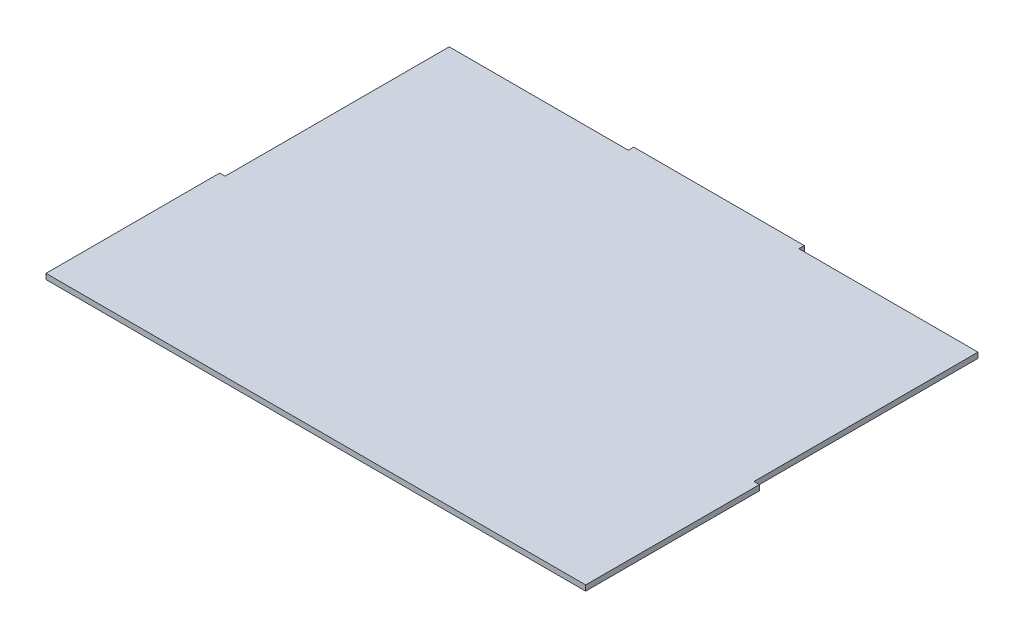
ISO-10303-21;
HEADER;
FILE_DESCRIPTION(('STEP AP214'),'2;1');
FILE_NAME('part.step','',(''),(''),'','','');
FILE_SCHEMA(('AUTOMOTIVE_DESIGN { 1 0 10303 214 1 1 1 1 }'));
ENDSEC;
DATA;
#1=APPLICATION_CONTEXT('core data for automotive mechanical design processes');
#2=APPLICATION_PROTOCOL_DEFINITION('international standard','automotive_design',2000,#1);
#3=PRODUCT_CONTEXT('',#1,'mechanical');
#4=PRODUCT('Part','Part','',(#3));
#5=PRODUCT_RELATED_PRODUCT_CATEGORY('part','',(#4));
#6=PRODUCT_DEFINITION_FORMATION('','',#4);
#7=PRODUCT_DEFINITION_CONTEXT('part definition',#1,'design');
#8=PRODUCT_DEFINITION('design','',#6,#7);
#9=PRODUCT_DEFINITION_SHAPE('','',#8);
#10=(LENGTH_UNIT() NAMED_UNIT(*) SI_UNIT(.MILLI.,.METRE.));
#11=(NAMED_UNIT(*) PLANE_ANGLE_UNIT() SI_UNIT($,.RADIAN.));
#12=(NAMED_UNIT(*) SI_UNIT($,.STERADIAN.) SOLID_ANGLE_UNIT());
#13=UNCERTAINTY_MEASURE_WITH_UNIT(LENGTH_MEASURE(1.E-05),#10,'distance_accuracy_value','');
#14=(GEOMETRIC_REPRESENTATION_CONTEXT(3) GLOBAL_UNCERTAINTY_ASSIGNED_CONTEXT((#13)) GLOBAL_UNIT_ASSIGNED_CONTEXT((#10,
#11,#12)) REPRESENTATION_CONTEXT('',''));
#15=CARTESIAN_POINT('',(0.,0.,0.));
#16=DIRECTION('',(0.,0.,1.));
#17=DIRECTION('',(1.,0.,0.));
#18=AXIS2_PLACEMENT_3D('',#15,#16,#17);
#19=CARTESIAN_POINT('',(0.,0.,0.));
#20=DIRECTION('',(0.,0.,-1.));
#21=DIRECTION('',(-1.,0.,0.));
#22=AXIS2_PLACEMENT_3D('',#19,#20,#21);
#23=PLANE('',#22);
#24=DIRECTION('',(0.,-1.,0.));
#25=VECTOR('',#24,1.);
#26=CARTESIAN_POINT('',(49.84,1.5875,0.));
#27=LINE('',#26,#25);
#28=CARTESIAN_POINT('',(49.84,1.5875,0.));
#29=VERTEX_POINT('',#28);
#30=CARTESIAN_POINT('',(49.84,-1.5875,0.));
#31=VERTEX_POINT('',#30);
#32=EDGE_CURVE('E157',#29,#31,#27,.T.);
#33=ORIENTED_EDGE('',*,*,#32,.F.);
#34=DIRECTION('',(-1.,0.,0.));
#35=VECTOR('',#34,1.);
#36=CARTESIAN_POINT('',(-157.79,1.5875,0.));
#37=LINE('',#36,#35);
#38=CARTESIAN_POINT('',(154.615,1.5875,0.));
#39=VERTEX_POINT('',#38);
#40=EDGE_CURVE('E212',#39,#29,#37,.T.);
#41=ORIENTED_EDGE('',*,*,#40,.F.);
#42=DIRECTION('',(0.,1.,0.));
#43=VECTOR('',#42,1.);
#44=CARTESIAN_POINT('',(154.615,-1.5875,0.));
#45=LINE('',#44,#43);
#46=CARTESIAN_POINT('',(154.615,-1.5875,0.));
#47=VERTEX_POINT('',#46);
#48=EDGE_CURVE('E168',#47,#39,#45,.T.);
#49=ORIENTED_EDGE('',*,*,#48,.F.);
#50=DIRECTION('',(1.,0.,0.));
#51=VECTOR('',#50,1.);
#52=CARTESIAN_POINT('',(-157.79,-1.5875,0.));
#53=LINE('',#52,#51);
#54=EDGE_CURVE('E60',#31,#47,#53,.T.);
#55=ORIENTED_EDGE('',*,*,#54,.F.);
#56=EDGE_LOOP('',(#33,#41,#49,#55));
#57=FACE_BOUND('',#56,.T.);
#58=ADVANCED_FACE('F45',(#57),#23,.T.);
#59=CARTESIAN_POINT('',(157.79,-1.5875,232.600000128));
#60=DIRECTION('',(-1.,0.,0.));
#61=DIRECTION('',(0.,0.,1.));
#62=AXIS2_PLACEMENT_3D('',#59,#60,#61);
#63=PLANE('',#62);
#64=DIRECTION('',(0.,1.,0.));
#65=VECTOR('',#64,1.);
#66=CARTESIAN_POINT('',(157.79,-1.5875,130.999992));
#67=LINE('',#66,#65);
#68=CARTESIAN_POINT('',(157.79,-1.5875,130.999992));
#69=VERTEX_POINT('',#68);
#70=CARTESIAN_POINT('',(157.79,1.5875,130.999992));
#71=VERTEX_POINT('',#70);
#72=EDGE_CURVE('E169',#69,#71,#67,.T.);
#73=ORIENTED_EDGE('',*,*,#72,.T.);
#74=DIRECTION('',(0.,0.,-1.));
#75=VECTOR('',#74,1.);
#76=CARTESIAN_POINT('',(157.79,1.5875,232.600000128));
#77=LINE('',#76,#75);
#78=CARTESIAN_POINT('',(157.79,1.5875,232.600000128));
#79=VERTEX_POINT('',#78);
#80=EDGE_CURVE('E11',#79,#71,#77,.T.);
#81=ORIENTED_EDGE('',*,*,#80,.F.);
#82=DIRECTION('',(0.,1.,0.));
#83=VECTOR('',#82,1.);
#84=CARTESIAN_POINT('',(157.79,-1.5875,232.600000128));
#85=LINE('',#84,#83);
#86=CARTESIAN_POINT('',(157.79,-1.5875,232.600000128));
#87=VERTEX_POINT('',#86);
#88=EDGE_CURVE('E201',#87,#79,#85,.T.);
#89=ORIENTED_EDGE('',*,*,#88,.F.);
#90=DIRECTION('',(0.,0.,-1.));
#91=VECTOR('',#90,1.);
#92=CARTESIAN_POINT('',(157.79,-1.5875,232.600000128));
#93=LINE('',#92,#91);
#94=EDGE_CURVE('E211',#87,#69,#93,.T.);
#95=ORIENTED_EDGE('',*,*,#94,.T.);
#96=EDGE_LOOP('',(#73,#81,#89,#95));
#97=FACE_BOUND('',#96,.T.);
#98=ADVANCED_FACE('F47',(#97),#63,.F.);
#99=CARTESIAN_POINT('',(-157.79,1.5875,232.600000128));
#100=DIRECTION('',(0.,-1.,0.));
#101=DIRECTION('',(0.,0.,-1.));
#102=AXIS2_PLACEMENT_3D('',#99,#100,#101);
#103=PLANE('',#102);
#104=DIRECTION('',(1.,0.,0.));
#105=VECTOR('',#104,1.);
#106=CARTESIAN_POINT('',(-157.79,1.5875,130.999992));
#107=LINE('',#106,#105);
#108=CARTESIAN_POINT('',(154.615,1.5875,130.999992));
#109=VERTEX_POINT('',#108);
#110=EDGE_CURVE('E178',#109,#71,#107,.T.);
#111=ORIENTED_EDGE('',*,*,#110,.F.);
#112=DIRECTION('',(0.,0.,1.));
#113=VECTOR('',#112,1.);
#114=CARTESIAN_POINT('',(154.615,1.5875,232.600000128));
#115=LINE('',#114,#113);
#116=EDGE_CURVE('E172',#39,#109,#115,.T.);
#117=ORIENTED_EDGE('',*,*,#116,.F.);
#118=ORIENTED_EDGE('',*,*,#40,.T.);
#119=DIRECTION('',(0.,0.,1.));
#120=VECTOR('',#119,1.);
#121=CARTESIAN_POINT('',(49.84,1.5875,-3.175));
#122=LINE('',#121,#120);
#123=CARTESIAN_POINT('',(49.84,1.5875,-3.175));
#124=VERTEX_POINT('',#123);
#125=EDGE_CURVE('E251',#124,#29,#122,.T.);
#126=ORIENTED_EDGE('',*,*,#125,.F.);
#127=DIRECTION('',(1.,0.,0.));
#128=VECTOR('',#127,1.);
#129=CARTESIAN_POINT('',(49.84,1.5875,-3.175));
#130=LINE('',#129,#128);
#131=CARTESIAN_POINT('',(-49.84,1.5875,-3.175));
#132=VERTEX_POINT('',#131);
#133=EDGE_CURVE('E151',#132,#124,#130,.T.);
#134=ORIENTED_EDGE('',*,*,#133,.F.);
#135=DIRECTION('',(0.,0.,1.));
#136=VECTOR('',#135,1.);
#137=CARTESIAN_POINT('',(-49.84,1.5875,-3.175));
#138=LINE('',#137,#136);
#139=CARTESIAN_POINT('',(-49.84,1.5875,0.));
#140=VERTEX_POINT('',#139);
#141=EDGE_CURVE('E163',#132,#140,#138,.T.);
#142=ORIENTED_EDGE('',*,*,#141,.T.);
#143=CARTESIAN_POINT('',(-154.615,1.5875,0.));
#144=VERTEX_POINT('',#143);
#145=EDGE_CURVE('E200',#140,#144,#37,.T.);
#146=ORIENTED_EDGE('',*,*,#145,.T.);
#147=DIRECTION('',(0.,0.,1.));
#148=VECTOR('',#147,1.);
#149=CARTESIAN_POINT('',(-154.615,1.5875,232.600000128));
#150=LINE('',#149,#148);
#151=CARTESIAN_POINT('',(-154.615,1.5875,130.999992));
#152=VERTEX_POINT('',#151);
#153=EDGE_CURVE('E190',#144,#152,#150,.T.);
#154=ORIENTED_EDGE('',*,*,#153,.T.);
#155=DIRECTION('',(-1.,0.,0.));
#156=VECTOR('',#155,1.);
#157=CARTESIAN_POINT('',(-157.79,1.5875,130.999992));
#158=LINE('',#157,#156);
#159=CARTESIAN_POINT('',(-157.79,1.5875,130.999992));
#160=VERTEX_POINT('',#159);
#161=EDGE_CURVE('E197',#152,#160,#158,.T.);
#162=ORIENTED_EDGE('',*,*,#161,.T.);
#163=DIRECTION('',(0.,0.,-1.));
#164=VECTOR('',#163,1.);
#165=CARTESIAN_POINT('',(-157.79,1.5875,232.600000128));
#166=LINE('',#165,#164);
#167=CARTESIAN_POINT('',(-157.79,1.5875,232.600000128));
#168=VERTEX_POINT('',#167);
#169=EDGE_CURVE('E53',#168,#160,#166,.T.);
#170=ORIENTED_EDGE('',*,*,#169,.F.);
#171=DIRECTION('',(-1.,0.,0.));
#172=VECTOR('',#171,1.);
#173=CARTESIAN_POINT('',(-157.79,1.5875,232.600000128));
#174=LINE('',#173,#172);
#175=EDGE_CURVE('E204',#79,#168,#174,.T.);
#176=ORIENTED_EDGE('',*,*,#175,.F.);
#177=ORIENTED_EDGE('',*,*,#80,.T.);
#178=EDGE_LOOP('',(#111,#117,#118,#126,#134,#142,#146,#154,#162,#170,#176,#177));
#179=FACE_BOUND('',#178,.T.);
#180=ADVANCED_FACE('F229',(#179),#103,.F.);
#181=CARTESIAN_POINT('',(-157.79,-1.5875,232.600000128));
#182=DIRECTION('',(0.,1.,0.));
#183=DIRECTION('',(0.,0.,1.));
#184=AXIS2_PLACEMENT_3D('',#181,#182,#183);
#185=PLANE('',#184);
#186=DIRECTION('',(-1.,0.,0.));
#187=VECTOR('',#186,1.);
#188=CARTESIAN_POINT('',(157.79,-1.5875,130.999992));
#189=LINE('',#188,#187);
#190=CARTESIAN_POINT('',(154.615,-1.5875,130.999992));
#191=VERTEX_POINT('',#190);
#192=EDGE_CURVE('E161',#69,#191,#189,.T.);
#193=ORIENTED_EDGE('',*,*,#192,.F.);
#194=ORIENTED_EDGE('',*,*,#94,.F.);
#195=DIRECTION('',(1.,0.,0.));
#196=VECTOR('',#195,1.);
#197=CARTESIAN_POINT('',(-157.79,-1.5875,232.600000128));
#198=LINE('',#197,#196);
#199=CARTESIAN_POINT('',(-157.79,-1.5875,232.600000128));
#200=VERTEX_POINT('',#199);
#201=EDGE_CURVE('E209',#200,#87,#198,.T.);
#202=ORIENTED_EDGE('',*,*,#201,.F.);
#203=DIRECTION('',(0.,0.,-1.));
#204=VECTOR('',#203,1.);
#205=CARTESIAN_POINT('',(-157.79,-1.5875,232.600000128));
#206=LINE('',#205,#204);
#207=CARTESIAN_POINT('',(-157.79,-1.5875,130.999992));
#208=VERTEX_POINT('',#207);
#209=EDGE_CURVE('E218',#200,#208,#206,.T.);
#210=ORIENTED_EDGE('',*,*,#209,.T.);
#211=DIRECTION('',(1.,0.,0.));
#212=VECTOR('',#211,1.);
#213=CARTESIAN_POINT('',(-157.79,-1.5875,130.999992));
#214=LINE('',#213,#212);
#215=CARTESIAN_POINT('',(-154.615,-1.5875,130.999992));
#216=VERTEX_POINT('',#215);
#217=EDGE_CURVE('E180',#208,#216,#214,.T.);
#218=ORIENTED_EDGE('',*,*,#217,.T.);
#219=DIRECTION('',(0.,0.,-1.));
#220=VECTOR('',#219,1.);
#221=CARTESIAN_POINT('',(-154.615,-1.5875,0.));
#222=LINE('',#221,#220);
#223=CARTESIAN_POINT('',(-154.615,-1.5875,0.));
#224=VERTEX_POINT('',#223);
#225=EDGE_CURVE('E183',#216,#224,#222,.T.);
#226=ORIENTED_EDGE('',*,*,#225,.T.);
#227=CARTESIAN_POINT('',(-49.84,-1.5875,0.));
#228=VERTEX_POINT('',#227);
#229=EDGE_CURVE('E205',#224,#228,#53,.T.);
#230=ORIENTED_EDGE('',*,*,#229,.T.);
#231=DIRECTION('',(0.,0.,1.));
#232=VECTOR('',#231,1.);
#233=CARTESIAN_POINT('',(-49.84,-1.5875,-3.175));
#234=LINE('',#233,#232);
#235=CARTESIAN_POINT('',(-49.84,-1.5875,-3.175));
#236=VERTEX_POINT('',#235);
#237=EDGE_CURVE('E142',#236,#228,#234,.T.);
#238=ORIENTED_EDGE('',*,*,#237,.F.);
#239=DIRECTION('',(-1.,0.,0.));
#240=VECTOR('',#239,1.);
#241=CARTESIAN_POINT('',(49.84,-1.5875,-3.175));
#242=LINE('',#241,#240);
#243=CARTESIAN_POINT('',(49.84,-1.5875,-3.175));
#244=VERTEX_POINT('',#243);
#245=EDGE_CURVE('E134',#244,#236,#242,.T.);
#246=ORIENTED_EDGE('',*,*,#245,.F.);
#247=DIRECTION('',(0.,0.,1.));
#248=VECTOR('',#247,1.);
#249=CARTESIAN_POINT('',(49.84,-1.5875,-3.175));
#250=LINE('',#249,#248);
#251=EDGE_CURVE('E139',#244,#31,#250,.T.);
#252=ORIENTED_EDGE('',*,*,#251,.T.);
#253=ORIENTED_EDGE('',*,*,#54,.T.);
#254=DIRECTION('',(0.,0.,-1.));
#255=VECTOR('',#254,1.);
#256=CARTESIAN_POINT('',(154.615,-1.5875,0.));
#257=LINE('',#256,#255);
#258=EDGE_CURVE('E158',#191,#47,#257,.T.);
#259=ORIENTED_EDGE('',*,*,#258,.F.);
#260=EDGE_LOOP('',(#193,#194,#202,#210,#218,#226,#230,#238,#246,#252,#253,#259));
#261=FACE_BOUND('',#260,.T.);
#262=ADVANCED_FACE('F137',(#261),#185,.F.);
#263=DIRECTION('',(0.,1.,0.));
#264=VECTOR('',#263,1.);
#265=CARTESIAN_POINT('',(-49.84,1.5875,0.));
#266=LINE('',#265,#264);
#267=EDGE_CURVE('E68',#228,#140,#266,.T.);
#268=ORIENTED_EDGE('',*,*,#267,.F.);
#269=ORIENTED_EDGE('',*,*,#229,.F.);
#270=DIRECTION('',(0.,1.,0.));
#271=VECTOR('',#270,1.);
#272=CARTESIAN_POINT('',(-154.615,-1.5875,0.));
#273=LINE('',#272,#271);
#274=EDGE_CURVE('E187',#224,#144,#273,.T.);
#275=ORIENTED_EDGE('',*,*,#274,.T.);
#276=ORIENTED_EDGE('',*,*,#145,.F.);
#277=EDGE_LOOP('',(#268,#269,#275,#276));
#278=FACE_BOUND('',#277,.T.);
#279=ADVANCED_FACE('F261',(#278),#23,.T.);
#280=CARTESIAN_POINT('',(-157.79,-1.5875,232.600000128));
#281=DIRECTION('',(1.,0.,0.));
#282=DIRECTION('',(0.,0.,-1.));
#283=AXIS2_PLACEMENT_3D('',#280,#281,#282);
#284=PLANE('',#283);
#285=ORIENTED_EDGE('',*,*,#169,.T.);
#286=DIRECTION('',(0.,1.,0.));
#287=VECTOR('',#286,1.);
#288=CARTESIAN_POINT('',(-157.79,-1.5875,130.999992));
#289=LINE('',#288,#287);
#290=EDGE_CURVE('E186',#208,#160,#289,.T.);
#291=ORIENTED_EDGE('',*,*,#290,.F.);
#292=ORIENTED_EDGE('',*,*,#209,.F.);
#293=DIRECTION('',(0.,-1.,0.));
#294=VECTOR('',#293,1.);
#295=CARTESIAN_POINT('',(-157.79,-1.5875,232.600000128));
#296=LINE('',#295,#294);
#297=EDGE_CURVE('E207',#168,#200,#296,.T.);
#298=ORIENTED_EDGE('',*,*,#297,.F.);
#299=EDGE_LOOP('',(#285,#291,#292,#298));
#300=FACE_BOUND('',#299,.T.);
#301=ADVANCED_FACE('F225',(#300),#284,.F.);
#302=CARTESIAN_POINT('',(0.,0.,232.600000128));
#303=DIRECTION('',(0.,0.,-1.));
#304=DIRECTION('',(-1.,0.,0.));
#305=AXIS2_PLACEMENT_3D('',#302,#303,#304);
#306=PLANE('',#305);
#307=ORIENTED_EDGE('',*,*,#88,.T.);
#308=ORIENTED_EDGE('',*,*,#175,.T.);
#309=ORIENTED_EDGE('',*,*,#297,.T.);
#310=ORIENTED_EDGE('',*,*,#201,.T.);
#311=EDGE_LOOP('',(#307,#308,#309,#310));
#312=FACE_BOUND('',#311,.T.);
#313=ADVANCED_FACE('F240',(#312),#306,.F.);
#314=CARTESIAN_POINT('',(-157.79,-1.5875,130.999992));
#315=DIRECTION('',(0.,0.,1.));
#316=DIRECTION('',(1.,0.,0.));
#317=AXIS2_PLACEMENT_3D('',#314,#315,#316);
#318=PLANE('',#317);
#319=DIRECTION('',(0.,1.,0.));
#320=VECTOR('',#319,1.);
#321=CARTESIAN_POINT('',(-154.615,-1.5875,130.999992));
#322=LINE('',#321,#320);
#323=EDGE_CURVE('E191',#216,#152,#322,.T.);
#324=ORIENTED_EDGE('',*,*,#323,.F.);
#325=ORIENTED_EDGE('',*,*,#217,.F.);
#326=ORIENTED_EDGE('',*,*,#290,.T.);
#327=ORIENTED_EDGE('',*,*,#161,.F.);
#328=EDGE_LOOP('',(#324,#325,#326,#327));
#329=FACE_BOUND('',#328,.T.);
#330=ADVANCED_FACE('F232',(#329),#318,.F.);
#331=CARTESIAN_POINT('',(-154.615,-1.5875,0.));
#332=DIRECTION('',(1.,0.,0.));
#333=DIRECTION('',(0.,0.,-1.));
#334=AXIS2_PLACEMENT_3D('',#331,#332,#333);
#335=PLANE('',#334);
#336=ORIENTED_EDGE('',*,*,#274,.F.);
#337=ORIENTED_EDGE('',*,*,#225,.F.);
#338=ORIENTED_EDGE('',*,*,#323,.T.);
#339=ORIENTED_EDGE('',*,*,#153,.F.);
#340=EDGE_LOOP('',(#336,#337,#338,#339));
#341=FACE_BOUND('',#340,.T.);
#342=ADVANCED_FACE('F235',(#341),#335,.F.);
#343=CARTESIAN_POINT('',(157.79,-1.5875,130.999992));
#344=DIRECTION('',(0.,0.,-1.));
#345=DIRECTION('',(-1.,0.,0.));
#346=AXIS2_PLACEMENT_3D('',#343,#344,#345);
#347=PLANE('',#346);
#348=ORIENTED_EDGE('',*,*,#110,.T.);
#349=ORIENTED_EDGE('',*,*,#72,.F.);
#350=ORIENTED_EDGE('',*,*,#192,.T.);
#351=DIRECTION('',(0.,1.,0.));
#352=VECTOR('',#351,1.);
#353=CARTESIAN_POINT('',(154.615,-1.5875,130.999992));
#354=LINE('',#353,#352);
#355=EDGE_CURVE('E173',#191,#109,#354,.T.);
#356=ORIENTED_EDGE('',*,*,#355,.T.);
#357=EDGE_LOOP('',(#348,#349,#350,#356));
#358=FACE_BOUND('',#357,.T.);
#359=ADVANCED_FACE('F246',(#358),#347,.T.);
#360=CARTESIAN_POINT('',(154.615,-1.5875,0.));
#361=DIRECTION('',(1.,0.,0.));
#362=DIRECTION('',(0.,0.,-1.));
#363=AXIS2_PLACEMENT_3D('',#360,#361,#362);
#364=PLANE('',#363);
#365=ORIENTED_EDGE('',*,*,#116,.T.);
#366=ORIENTED_EDGE('',*,*,#355,.F.);
#367=ORIENTED_EDGE('',*,*,#258,.T.);
#368=ORIENTED_EDGE('',*,*,#48,.T.);
#369=EDGE_LOOP('',(#365,#366,#367,#368));
#370=FACE_BOUND('',#369,.T.);
#371=ADVANCED_FACE('F250',(#370),#364,.T.);
#372=CARTESIAN_POINT('',(49.84,1.5875,-3.175));
#373=DIRECTION('',(-1.,0.,0.));
#374=DIRECTION('',(0.,0.,1.));
#375=AXIS2_PLACEMENT_3D('',#372,#373,#374);
#376=PLANE('',#375);
#377=ORIENTED_EDGE('',*,*,#32,.T.);
#378=ORIENTED_EDGE('',*,*,#251,.F.);
#379=DIRECTION('',(0.,-1.,0.));
#380=VECTOR('',#379,1.);
#381=CARTESIAN_POINT('',(49.84,1.5875,-3.175));
#382=LINE('',#381,#380);
#383=EDGE_CURVE('E146',#124,#244,#382,.T.);
#384=ORIENTED_EDGE('',*,*,#383,.F.);
#385=ORIENTED_EDGE('',*,*,#125,.T.);
#386=EDGE_LOOP('',(#377,#378,#384,#385));
#387=FACE_BOUND('',#386,.T.);
#388=ADVANCED_FACE('F156',(#387),#376,.F.);
#389=CARTESIAN_POINT('',(-49.84,1.5875,-3.175));
#390=DIRECTION('',(1.,0.,0.));
#391=DIRECTION('',(0.,0.,-1.));
#392=AXIS2_PLACEMENT_3D('',#389,#390,#391);
#393=PLANE('',#392);
#394=ORIENTED_EDGE('',*,*,#267,.T.);
#395=ORIENTED_EDGE('',*,*,#141,.F.);
#396=DIRECTION('',(0.,1.,0.));
#397=VECTOR('',#396,1.);
#398=CARTESIAN_POINT('',(-49.84,1.5875,-3.175));
#399=LINE('',#398,#397);
#400=EDGE_CURVE('E145',#236,#132,#399,.T.);
#401=ORIENTED_EDGE('',*,*,#400,.F.);
#402=ORIENTED_EDGE('',*,*,#237,.T.);
#403=EDGE_LOOP('',(#394,#395,#401,#402));
#404=FACE_BOUND('',#403,.T.);
#405=ADVANCED_FACE('F260',(#404),#393,.F.);
#406=CARTESIAN_POINT('',(0.,0.,-3.175));
#407=DIRECTION('',(0.,0.,-1.));
#408=DIRECTION('',(-1.,0.,0.));
#409=AXIS2_PLACEMENT_3D('',#406,#407,#408);
#410=PLANE('',#409);
#411=ORIENTED_EDGE('',*,*,#383,.T.);
#412=ORIENTED_EDGE('',*,*,#245,.T.);
#413=ORIENTED_EDGE('',*,*,#400,.T.);
#414=ORIENTED_EDGE('',*,*,#133,.T.);
#415=EDGE_LOOP('',(#411,#412,#413,#414));
#416=FACE_BOUND('',#415,.T.);
#417=ADVANCED_FACE('F149',(#416),#410,.T.);
#418=CLOSED_SHELL('',(#58,#98,#180,#262,#279,#301,#313,#330,#342,#359,#371,#388,#405,#417));
#419=MANIFOLD_SOLID_BREP('B2',#418);
#420=ADVANCED_BREP_SHAPE_REPRESENTATION('',(#18,#419),#14);
#421=SHAPE_DEFINITION_REPRESENTATION(#9,#420);
ENDSEC;
END-ISO-10303-21;
